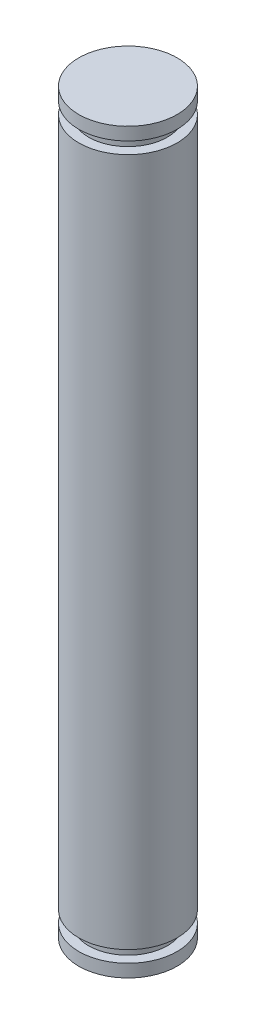
ISO-10303-21;
HEADER;
FILE_DESCRIPTION(('STEP AP214'),'2;1');
FILE_NAME('part.step','',(''),(''),'','','');
FILE_SCHEMA(('AUTOMOTIVE_DESIGN { 1 0 10303 214 1 1 1 1 }'));
ENDSEC;
DATA;
#1=APPLICATION_CONTEXT('core data for automotive mechanical design processes');
#2=APPLICATION_PROTOCOL_DEFINITION('international standard','automotive_design',2000,#1);
#3=PRODUCT_CONTEXT('',#1,'mechanical');
#4=PRODUCT('Part','Part','',(#3));
#5=PRODUCT_RELATED_PRODUCT_CATEGORY('part','',(#4));
#6=PRODUCT_DEFINITION_FORMATION('','',#4);
#7=PRODUCT_DEFINITION_CONTEXT('part definition',#1,'design');
#8=PRODUCT_DEFINITION('design','',#6,#7);
#9=PRODUCT_DEFINITION_SHAPE('','',#8);
#10=(LENGTH_UNIT() NAMED_UNIT(*) SI_UNIT(.MILLI.,.METRE.));
#11=(NAMED_UNIT(*) PLANE_ANGLE_UNIT() SI_UNIT($,.RADIAN.));
#12=(NAMED_UNIT(*) SI_UNIT($,.STERADIAN.) SOLID_ANGLE_UNIT());
#13=UNCERTAINTY_MEASURE_WITH_UNIT(LENGTH_MEASURE(1.E-05),#10,'distance_accuracy_value','');
#14=(GEOMETRIC_REPRESENTATION_CONTEXT(3) GLOBAL_UNCERTAINTY_ASSIGNED_CONTEXT((#13)) GLOBAL_UNIT_ASSIGNED_CONTEXT((#10,
#11,#12)) REPRESENTATION_CONTEXT('',''));
#15=CARTESIAN_POINT('',(0.,0.,0.));
#16=DIRECTION('',(0.,0.,1.));
#17=DIRECTION('',(1.,0.,0.));
#18=AXIS2_PLACEMENT_3D('',#15,#16,#17);
#19=CARTESIAN_POINT('',(0.,0.,0.));
#20=DIRECTION('',(0.,-1.,0.));
#21=DIRECTION('',(0.,0.,-1.));
#22=AXIS2_PLACEMENT_3D('',#19,#20,#21);
#23=PLANE('',#22);
#24=CARTESIAN_POINT('',(0.,0.,0.));
#25=DIRECTION('',(0.,1.,0.));
#26=DIRECTION('',(0.,0.,1.));
#27=AXIS2_PLACEMENT_3D('',#24,#25,#26);
#28=CIRCLE('',#27,5.);
#29=CARTESIAN_POINT('',(0.,0.,5.));
#30=VERTEX_POINT('',#29);
#31=EDGE_CURVE('E10',#30,#30,#28,.T.);
#32=ORIENTED_EDGE('',*,*,#31,.F.);
#33=EDGE_LOOP('',(#32));
#34=FACE_BOUND('',#33,.T.);
#35=ADVANCED_FACE('F37',(#34),#23,.T.);
#36=CARTESIAN_POINT('',(0.,75.,0.));
#37=DIRECTION('',(0.,1.,0.));
#38=DIRECTION('',(0.,0.,1.));
#39=AXIS2_PLACEMENT_3D('',#36,#37,#38);
#40=CYLINDRICAL_SURFACE('',#39,5.);
#41=ORIENTED_EDGE('',*,*,#31,.T.);
#42=EDGE_LOOP('',(#41));
#43=FACE_BOUND('',#42,.T.);
#44=CARTESIAN_POINT('',(0.,1.3,0.));
#45=DIRECTION('',(0.,1.,0.));
#46=DIRECTION('',(0.,0.,1.));
#47=AXIS2_PLACEMENT_3D('',#44,#45,#46);
#48=CIRCLE('',#47,5.);
#49=CARTESIAN_POINT('',(0.,1.3,5.));
#50=VERTEX_POINT('',#49);
#51=EDGE_CURVE('E44',#50,#50,#48,.T.);
#52=ORIENTED_EDGE('',*,*,#51,.F.);
#53=EDGE_LOOP('',(#52));
#54=FACE_BOUND('',#53,.T.);
#55=ADVANCED_FACE('F101',(#43,#54),#40,.T.);
#56=CARTESIAN_POINT('',(-5.,1.3,0.));
#57=DIRECTION('',(0.,1.,0.));
#58=DIRECTION('',(0.,0.,1.));
#59=AXIS2_PLACEMENT_3D('',#56,#57,#58);
#60=PLANE('',#59);
#61=ORIENTED_EDGE('',*,*,#51,.T.);
#62=EDGE_LOOP('',(#61));
#63=FACE_BOUND('',#62,.T.);
#64=CARTESIAN_POINT('',(0.,1.3,0.));
#65=DIRECTION('',(0.,1.,0.));
#66=DIRECTION('',(0.,0.,1.));
#67=AXIS2_PLACEMENT_3D('',#64,#65,#66);
#68=CIRCLE('',#67,4.);
#69=CARTESIAN_POINT('',(0.,1.3,4.));
#70=VERTEX_POINT('',#69);
#71=EDGE_CURVE('E49',#70,#70,#68,.T.);
#72=ORIENTED_EDGE('',*,*,#71,.F.);
#73=EDGE_LOOP('',(#72));
#74=FACE_BOUND('',#73,.T.);
#75=ADVANCED_FACE('F106',(#63,#74),#60,.T.);
#76=CARTESIAN_POINT('',(0.,75.,0.));
#77=DIRECTION('',(0.,1.,0.));
#78=DIRECTION('',(0.,0.,1.));
#79=AXIS2_PLACEMENT_3D('',#76,#77,#78);
#80=CYLINDRICAL_SURFACE('',#79,4.);
#81=ORIENTED_EDGE('',*,*,#71,.T.);
#82=EDGE_LOOP('',(#81));
#83=FACE_BOUND('',#82,.T.);
#84=CARTESIAN_POINT('',(0.,2.5,0.));
#85=DIRECTION('',(0.,1.,0.));
#86=DIRECTION('',(0.,0.,1.));
#87=AXIS2_PLACEMENT_3D('',#84,#85,#86);
#88=CIRCLE('',#87,4.);
#89=CARTESIAN_POINT('',(0.,2.5,4.));
#90=VERTEX_POINT('',#89);
#91=EDGE_CURVE('E54',#90,#90,#88,.T.);
#92=ORIENTED_EDGE('',*,*,#91,.F.);
#93=EDGE_LOOP('',(#92));
#94=FACE_BOUND('',#93,.T.);
#95=ADVANCED_FACE('F110',(#83,#94),#80,.T.);
#96=CARTESIAN_POINT('',(-4.,2.5,0.));
#97=DIRECTION('',(0.,-1.,0.));
#98=DIRECTION('',(0.,0.,-1.));
#99=AXIS2_PLACEMENT_3D('',#96,#97,#98);
#100=PLANE('',#99);
#101=ORIENTED_EDGE('',*,*,#91,.T.);
#102=EDGE_LOOP('',(#101));
#103=FACE_BOUND('',#102,.T.);
#104=CARTESIAN_POINT('',(0.,2.49999999999999,0.));
#105=DIRECTION('',(0.,1.,0.));
#106=DIRECTION('',(0.,0.,1.));
#107=AXIS2_PLACEMENT_3D('',#104,#105,#106);
#108=CIRCLE('',#107,5.);
#109=CARTESIAN_POINT('',(0.,2.49999999999999,5.));
#110=VERTEX_POINT('',#109);
#111=EDGE_CURVE('E60',#110,#110,#108,.T.);
#112=ORIENTED_EDGE('',*,*,#111,.F.);
#113=EDGE_LOOP('',(#112));
#114=FACE_BOUND('',#113,.T.);
#115=ADVANCED_FACE('F116',(#103,#114),#100,.T.);
#116=CARTESIAN_POINT('',(0.,75.,0.));
#117=DIRECTION('',(0.,1.,0.));
#118=DIRECTION('',(0.,0.,1.));
#119=AXIS2_PLACEMENT_3D('',#116,#117,#118);
#120=CYLINDRICAL_SURFACE('',#119,5.);
#121=ORIENTED_EDGE('',*,*,#111,.T.);
#122=EDGE_LOOP('',(#121));
#123=FACE_BOUND('',#122,.T.);
#124=CARTESIAN_POINT('',(0.,72.5,0.));
#125=DIRECTION('',(0.,1.,0.));
#126=DIRECTION('',(0.,0.,1.));
#127=AXIS2_PLACEMENT_3D('',#124,#125,#126);
#128=CIRCLE('',#127,5.);
#129=CARTESIAN_POINT('',(0.,72.5,5.));
#130=VERTEX_POINT('',#129);
#131=EDGE_CURVE('E64',#130,#130,#128,.T.);
#132=ORIENTED_EDGE('',*,*,#131,.F.);
#133=EDGE_LOOP('',(#132));
#134=FACE_BOUND('',#133,.T.);
#135=ADVANCED_FACE('F120',(#123,#134),#120,.T.);
#136=CARTESIAN_POINT('',(-5.,72.5,0.));
#137=DIRECTION('',(0.,1.,0.));
#138=DIRECTION('',(0.,0.,1.));
#139=AXIS2_PLACEMENT_3D('',#136,#137,#138);
#140=PLANE('',#139);
#141=ORIENTED_EDGE('',*,*,#131,.T.);
#142=EDGE_LOOP('',(#141));
#143=FACE_BOUND('',#142,.T.);
#144=CARTESIAN_POINT('',(0.,72.5,0.));
#145=DIRECTION('',(0.,1.,0.));
#146=DIRECTION('',(0.,0.,1.));
#147=AXIS2_PLACEMENT_3D('',#144,#145,#146);
#148=CIRCLE('',#147,4.);
#149=CARTESIAN_POINT('',(0.,72.5,4.));
#150=VERTEX_POINT('',#149);
#151=EDGE_CURVE('E68',#150,#150,#148,.T.);
#152=ORIENTED_EDGE('',*,*,#151,.F.);
#153=EDGE_LOOP('',(#152));
#154=FACE_BOUND('',#153,.T.);
#155=ADVANCED_FACE('F124',(#143,#154),#140,.T.);
#156=CARTESIAN_POINT('',(0.,75.,0.));
#157=DIRECTION('',(0.,1.,0.));
#158=DIRECTION('',(0.,0.,1.));
#159=AXIS2_PLACEMENT_3D('',#156,#157,#158);
#160=CYLINDRICAL_SURFACE('',#159,4.);
#161=ORIENTED_EDGE('',*,*,#151,.T.);
#162=EDGE_LOOP('',(#161));
#163=FACE_BOUND('',#162,.T.);
#164=CARTESIAN_POINT('',(0.,73.7,0.));
#165=DIRECTION('',(0.,1.,0.));
#166=DIRECTION('',(0.,0.,1.));
#167=AXIS2_PLACEMENT_3D('',#164,#165,#166);
#168=CIRCLE('',#167,4.);
#169=CARTESIAN_POINT('',(0.,73.7,4.));
#170=VERTEX_POINT('',#169);
#171=EDGE_CURVE('E72',#170,#170,#168,.T.);
#172=ORIENTED_EDGE('',*,*,#171,.F.);
#173=EDGE_LOOP('',(#172));
#174=FACE_BOUND('',#173,.T.);
#175=ADVANCED_FACE('F97',(#163,#174),#160,.T.);
#176=CARTESIAN_POINT('',(-4.,73.7,0.));
#177=DIRECTION('',(0.,-1.,0.));
#178=DIRECTION('',(0.,0.,-1.));
#179=AXIS2_PLACEMENT_3D('',#176,#177,#178);
#180=PLANE('',#179);
#181=ORIENTED_EDGE('',*,*,#171,.T.);
#182=EDGE_LOOP('',(#181));
#183=FACE_BOUND('',#182,.T.);
#184=CARTESIAN_POINT('',(0.,73.7,0.));
#185=DIRECTION('',(0.,1.,0.));
#186=DIRECTION('',(0.,0.,1.));
#187=AXIS2_PLACEMENT_3D('',#184,#185,#186);
#188=CIRCLE('',#187,5.);
#189=CARTESIAN_POINT('',(0.,73.7,5.));
#190=VERTEX_POINT('',#189);
#191=EDGE_CURVE('E76',#190,#190,#188,.T.);
#192=ORIENTED_EDGE('',*,*,#191,.F.);
#193=EDGE_LOOP('',(#192));
#194=FACE_BOUND('',#193,.T.);
#195=ADVANCED_FACE('F89',(#183,#194),#180,.T.);
#196=CARTESIAN_POINT('',(0.,75.,0.));
#197=DIRECTION('',(0.,1.,0.));
#198=DIRECTION('',(0.,0.,1.));
#199=AXIS2_PLACEMENT_3D('',#196,#197,#198);
#200=CYLINDRICAL_SURFACE('',#199,5.);
#201=ORIENTED_EDGE('',*,*,#191,.T.);
#202=EDGE_LOOP('',(#201));
#203=FACE_BOUND('',#202,.T.);
#204=CARTESIAN_POINT('',(0.,75.,0.));
#205=DIRECTION('',(0.,1.,0.));
#206=DIRECTION('',(0.,0.,1.));
#207=AXIS2_PLACEMENT_3D('',#204,#205,#206);
#208=CIRCLE('',#207,5.);
#209=CARTESIAN_POINT('',(0.,75.,5.));
#210=VERTEX_POINT('',#209);
#211=EDGE_CURVE('E80',#210,#210,#208,.T.);
#212=ORIENTED_EDGE('',*,*,#211,.F.);
#213=EDGE_LOOP('',(#212));
#214=FACE_BOUND('',#213,.T.);
#215=ADVANCED_FACE('F87',(#203,#214),#200,.T.);
#216=CARTESIAN_POINT('',(-5.,75.,0.));
#217=DIRECTION('',(0.,1.,0.));
#218=DIRECTION('',(0.,0.,1.));
#219=AXIS2_PLACEMENT_3D('',#216,#217,#218);
#220=PLANE('',#219);
#221=ORIENTED_EDGE('',*,*,#211,.T.);
#222=EDGE_LOOP('',(#221));
#223=FACE_BOUND('',#222,.T.);
#224=ADVANCED_FACE('F85',(#223),#220,.T.);
#225=CLOSED_SHELL('',(#35,#55,#75,#95,#115,#135,#155,#175,#195,#215,#224));
#226=MANIFOLD_SOLID_BREP('B2',#225);
#227=ADVANCED_BREP_SHAPE_REPRESENTATION('',(#18,#226),#14);
#228=SHAPE_DEFINITION_REPRESENTATION(#9,#227);
ENDSEC;
END-ISO-10303-21;
